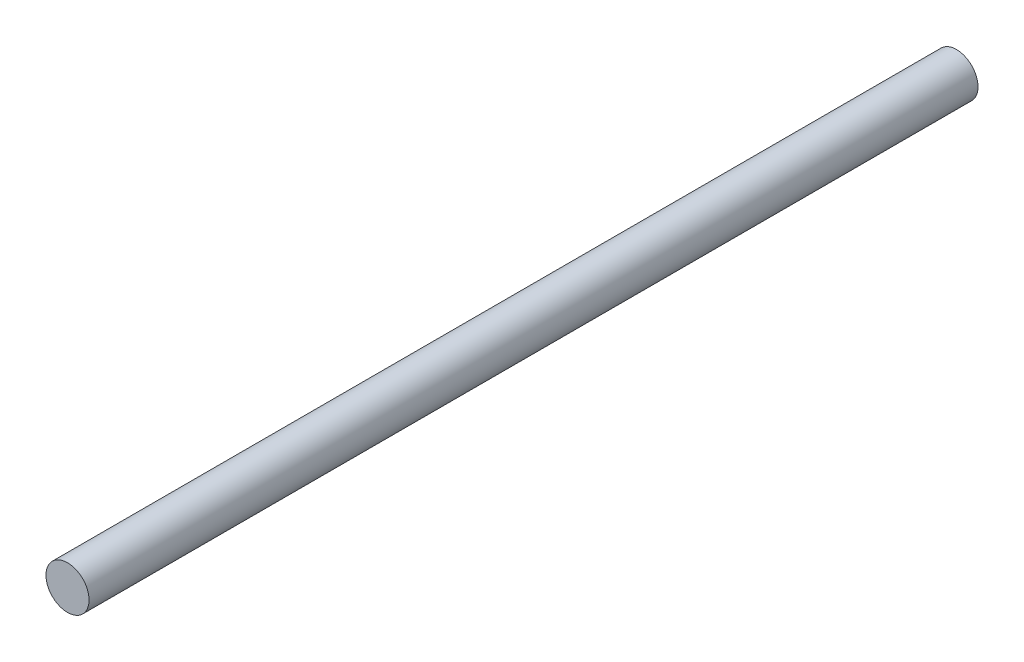
ISO-10303-21;
HEADER;
FILE_DESCRIPTION(('STEP AP214'),'2;1');
FILE_NAME('part.step','',(''),(''),'','','');
FILE_SCHEMA(('AUTOMOTIVE_DESIGN { 1 0 10303 214 1 1 1 1 }'));
ENDSEC;
DATA;
#1=APPLICATION_CONTEXT('core data for automotive mechanical design processes');
#2=APPLICATION_PROTOCOL_DEFINITION('international standard','automotive_design',2000,#1);
#3=PRODUCT_CONTEXT('',#1,'mechanical');
#4=PRODUCT('Part','Part','',(#3));
#5=PRODUCT_RELATED_PRODUCT_CATEGORY('part','',(#4));
#6=PRODUCT_DEFINITION_FORMATION('','',#4);
#7=PRODUCT_DEFINITION_CONTEXT('part definition',#1,'design');
#8=PRODUCT_DEFINITION('design','',#6,#7);
#9=PRODUCT_DEFINITION_SHAPE('','',#8);
#10=(LENGTH_UNIT() NAMED_UNIT(*) SI_UNIT(.MILLI.,.METRE.));
#11=(NAMED_UNIT(*) PLANE_ANGLE_UNIT() SI_UNIT($,.RADIAN.));
#12=(NAMED_UNIT(*) SI_UNIT($,.STERADIAN.) SOLID_ANGLE_UNIT());
#13=UNCERTAINTY_MEASURE_WITH_UNIT(LENGTH_MEASURE(1.E-05),#10,'distance_accuracy_value','');
#14=(GEOMETRIC_REPRESENTATION_CONTEXT(3) GLOBAL_UNCERTAINTY_ASSIGNED_CONTEXT((#13)) GLOBAL_UNIT_ASSIGNED_CONTEXT((#10,
#11,#12)) REPRESENTATION_CONTEXT('',''));
#15=CARTESIAN_POINT('',(0.,0.,0.));
#16=DIRECTION('',(0.,0.,1.));
#17=DIRECTION('',(1.,0.,0.));
#18=AXIS2_PLACEMENT_3D('',#15,#16,#17);
#19=CARTESIAN_POINT('',(0.,0.,41.91));
#20=DIRECTION('',(0.,0.,-1.));
#21=DIRECTION('',(-1.,0.,0.));
#22=AXIS2_PLACEMENT_3D('',#19,#20,#21);
#23=CYLINDRICAL_SURFACE('',#22,1.016);
#24=CARTESIAN_POINT('',(0.,0.,41.91));
#25=DIRECTION('',(0.,0.,1.));
#26=DIRECTION('',(1.,0.,0.));
#27=AXIS2_PLACEMENT_3D('',#24,#25,#26);
#28=CIRCLE('',#27,1.016);
#29=CARTESIAN_POINT('',(1.016,0.,41.91));
#30=VERTEX_POINT('',#29);
#31=EDGE_CURVE('E10',#30,#30,#28,.T.);
#32=ORIENTED_EDGE('',*,*,#31,.F.);
#33=EDGE_LOOP('',(#32));
#34=FACE_BOUND('',#33,.T.);
#35=CARTESIAN_POINT('',(0.,0.,0.));
#36=DIRECTION('',(0.,0.,1.));
#37=DIRECTION('',(1.,0.,0.));
#38=AXIS2_PLACEMENT_3D('',#35,#36,#37);
#39=CIRCLE('',#38,1.016);
#40=CARTESIAN_POINT('',(1.016,0.,0.));
#41=VERTEX_POINT('',#40);
#42=EDGE_CURVE('E42',#41,#41,#39,.T.);
#43=ORIENTED_EDGE('',*,*,#42,.T.);
#44=EDGE_LOOP('',(#43));
#45=FACE_BOUND('',#44,.T.);
#46=ADVANCED_FACE('F39',(#34,#45),#23,.T.);
#47=CARTESIAN_POINT('',(0.,0.,41.91));
#48=DIRECTION('',(0.,0.,1.));
#49=DIRECTION('',(1.,0.,0.));
#50=AXIS2_PLACEMENT_3D('',#47,#48,#49);
#51=PLANE('',#50);
#52=ORIENTED_EDGE('',*,*,#31,.T.);
#53=EDGE_LOOP('',(#52));
#54=FACE_BOUND('',#53,.T.);
#55=ADVANCED_FACE('F54',(#54),#51,.T.);
#56=CARTESIAN_POINT('',(0.,0.,0.));
#57=DIRECTION('',(0.,0.,1.));
#58=DIRECTION('',(1.,0.,0.));
#59=AXIS2_PLACEMENT_3D('',#56,#57,#58);
#60=PLANE('',#59);
#61=ORIENTED_EDGE('',*,*,#42,.F.);
#62=EDGE_LOOP('',(#61));
#63=FACE_BOUND('',#62,.T.);
#64=ADVANCED_FACE('F52',(#63),#60,.F.);
#65=CLOSED_SHELL('',(#46,#55,#64));
#66=MANIFOLD_SOLID_BREP('B2',#65);
#67=ADVANCED_BREP_SHAPE_REPRESENTATION('',(#18,#66),#14);
#68=SHAPE_DEFINITION_REPRESENTATION(#9,#67);
ENDSEC;
END-ISO-10303-21;
